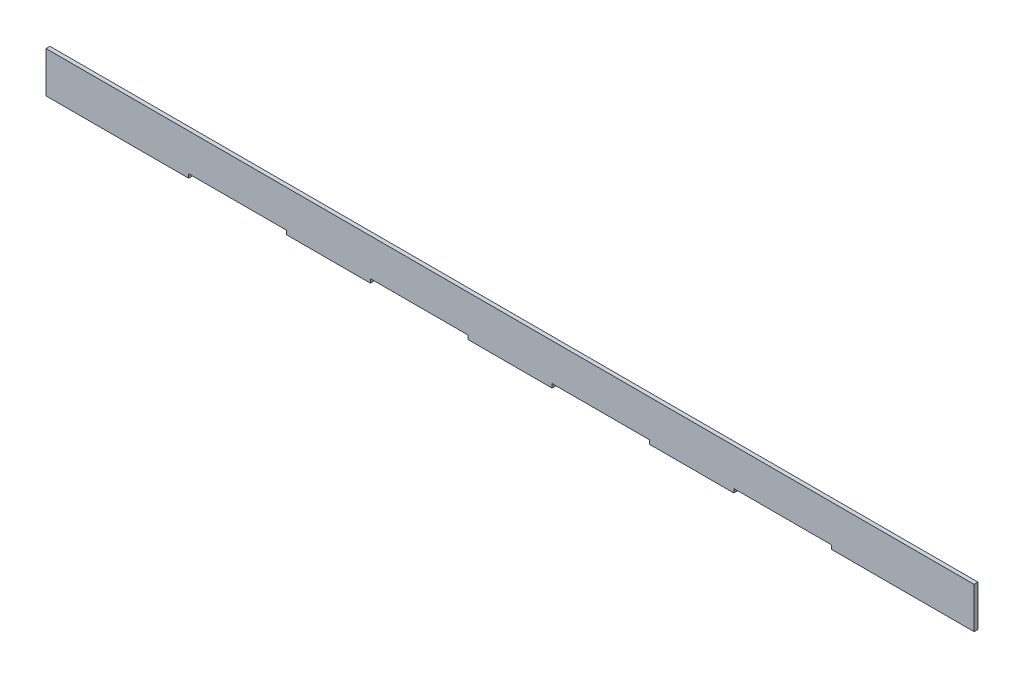
ISO-10303-21;
HEADER;
FILE_DESCRIPTION(('STEP AP214'),'2;1');
FILE_NAME('part.step','',(''),(''),'','','');
FILE_SCHEMA(('AUTOMOTIVE_DESIGN { 1 0 10303 214 1 1 1 1 }'));
ENDSEC;
DATA;
#1=APPLICATION_CONTEXT('core data for automotive mechanical design processes');
#2=APPLICATION_PROTOCOL_DEFINITION('international standard','automotive_design',2000,#1);
#3=PRODUCT_CONTEXT('',#1,'mechanical');
#4=PRODUCT('Part','Part','',(#3));
#5=PRODUCT_RELATED_PRODUCT_CATEGORY('part','',(#4));
#6=PRODUCT_DEFINITION_FORMATION('','',#4);
#7=PRODUCT_DEFINITION_CONTEXT('part definition',#1,'design');
#8=PRODUCT_DEFINITION('design','',#6,#7);
#9=PRODUCT_DEFINITION_SHAPE('','',#8);
#10=(LENGTH_UNIT() NAMED_UNIT(*) SI_UNIT(.MILLI.,.METRE.));
#11=(NAMED_UNIT(*) PLANE_ANGLE_UNIT() SI_UNIT($,.RADIAN.));
#12=(NAMED_UNIT(*) SI_UNIT($,.STERADIAN.) SOLID_ANGLE_UNIT());
#13=UNCERTAINTY_MEASURE_WITH_UNIT(LENGTH_MEASURE(1.E-05),#10,'distance_accuracy_value','');
#14=(GEOMETRIC_REPRESENTATION_CONTEXT(3) GLOBAL_UNCERTAINTY_ASSIGNED_CONTEXT((#13)) GLOBAL_UNIT_ASSIGNED_CONTEXT((#10,
#11,#12)) REPRESENTATION_CONTEXT('',''));
#15=CARTESIAN_POINT('',(0.,0.,0.));
#16=DIRECTION('',(0.,0.,1.));
#17=DIRECTION('',(1.,0.,0.));
#18=AXIS2_PLACEMENT_3D('',#15,#16,#17);
#19=CARTESIAN_POINT('',(-237.5,-10.5,2.));
#20=DIRECTION('',(0.,1.,0.));
#21=DIRECTION('',(0.,0.,1.));
#22=AXIS2_PLACEMENT_3D('',#19,#20,#21);
#23=PLANE('',#22);
#24=DIRECTION('',(0.,0.,1.));
#25=VECTOR('',#24,1.);
#26=CARTESIAN_POINT('',(114.5,-10.5,0.));
#27=LINE('',#26,#25);
#28=CARTESIAN_POINT('',(114.5,-10.5,0.));
#29=VERTEX_POINT('',#28);
#30=CARTESIAN_POINT('',(114.5,-10.5,2.));
#31=VERTEX_POINT('',#30);
#32=EDGE_CURVE('E272',#29,#31,#27,.T.);
#33=ORIENTED_EDGE('',*,*,#32,.T.);
#34=DIRECTION('',(1.,0.,0.));
#35=VECTOR('',#34,1.);
#36=CARTESIAN_POINT('',(-237.5,-10.5,2.));
#37=LINE('',#36,#35);
#38=CARTESIAN_POINT('',(71.5,-10.5,2.));
#39=VERTEX_POINT('',#38);
#40=EDGE_CURVE('E359',#39,#31,#37,.T.);
#41=ORIENTED_EDGE('',*,*,#40,.F.);
#42=DIRECTION('',(0.,0.,1.));
#43=VECTOR('',#42,1.);
#44=CARTESIAN_POINT('',(71.5,-10.5,0.));
#45=LINE('',#44,#43);
#46=CARTESIAN_POINT('',(71.5,-10.5,0.));
#47=VERTEX_POINT('',#46);
#48=EDGE_CURVE('E290',#47,#39,#45,.T.);
#49=ORIENTED_EDGE('',*,*,#48,.F.);
#50=DIRECTION('',(1.,0.,0.));
#51=VECTOR('',#50,1.);
#52=CARTESIAN_POINT('',(-237.5,-10.5,0.));
#53=LINE('',#52,#51);
#54=EDGE_CURVE('E205',#47,#29,#53,.T.);
#55=ORIENTED_EDGE('',*,*,#54,.T.);
#56=EDGE_LOOP('',(#33,#41,#49,#55));
#57=FACE_BOUND('',#56,.T.);
#58=ADVANCED_FACE('F33',(#57),#23,.F.);
#59=DIRECTION('',(0.,0.,1.));
#60=VECTOR('',#59,1.);
#61=CARTESIAN_POINT('',(21.5,-10.5,0.));
#62=LINE('',#61,#60);
#63=CARTESIAN_POINT('',(21.5,-10.5,0.));
#64=VERTEX_POINT('',#63);
#65=CARTESIAN_POINT('',(21.5,-10.5,2.));
#66=VERTEX_POINT('',#65);
#67=EDGE_CURVE('E296',#64,#66,#62,.T.);
#68=ORIENTED_EDGE('',*,*,#67,.T.);
#69=CARTESIAN_POINT('',(-21.5,-10.5,2.));
#70=VERTEX_POINT('',#69);
#71=EDGE_CURVE('E375',#70,#66,#37,.T.);
#72=ORIENTED_EDGE('',*,*,#71,.F.);
#73=DIRECTION('',(0.,0.,1.));
#74=VECTOR('',#73,1.);
#75=CARTESIAN_POINT('',(-21.5,-10.5,0.));
#76=LINE('',#75,#74);
#77=CARTESIAN_POINT('',(-21.5,-10.5,0.));
#78=VERTEX_POINT('',#77);
#79=EDGE_CURVE('E242',#78,#70,#76,.T.);
#80=ORIENTED_EDGE('',*,*,#79,.F.);
#81=EDGE_CURVE('E199',#78,#64,#53,.T.);
#82=ORIENTED_EDGE('',*,*,#81,.T.);
#83=EDGE_LOOP('',(#68,#72,#80,#82));
#84=FACE_BOUND('',#83,.T.);
#85=ADVANCED_FACE('F373',(#84),#23,.F.);
#86=DIRECTION('',(0.,0.,1.));
#87=VECTOR('',#86,1.);
#88=CARTESIAN_POINT('',(-164.5,-10.5,0.));
#89=LINE('',#88,#87);
#90=CARTESIAN_POINT('',(-164.5,-10.5,0.));
#91=VERTEX_POINT('',#90);
#92=CARTESIAN_POINT('',(-164.5,-10.5,2.));
#93=VERTEX_POINT('',#92);
#94=EDGE_CURVE('E259',#91,#93,#89,.T.);
#95=ORIENTED_EDGE('',*,*,#94,.T.);
#96=CARTESIAN_POINT('',(-237.5,-10.5,2.));
#97=VERTEX_POINT('',#96);
#98=EDGE_CURVE('E214',#97,#93,#37,.T.);
#99=ORIENTED_EDGE('',*,*,#98,.F.);
#100=DIRECTION('',(0.,0.,-1.));
#101=VECTOR('',#100,1.);
#102=CARTESIAN_POINT('',(-237.5,-10.5,2.));
#103=LINE('',#102,#101);
#104=CARTESIAN_POINT('',(-237.5,-10.5,0.));
#105=VERTEX_POINT('',#104);
#106=EDGE_CURVE('E213',#97,#105,#103,.T.);
#107=ORIENTED_EDGE('',*,*,#106,.T.);
#108=EDGE_CURVE('E198',#105,#91,#53,.T.);
#109=ORIENTED_EDGE('',*,*,#108,.T.);
#110=EDGE_LOOP('',(#95,#99,#107,#109));
#111=FACE_BOUND('',#110,.T.);
#112=ADVANCED_FACE('F331',(#111),#23,.F.);
#113=CARTESIAN_POINT('',(-114.5,-10.5,2.));
#114=VERTEX_POINT('',#113);
#115=CARTESIAN_POINT('',(-71.5,-10.5,2.));
#116=VERTEX_POINT('',#115);
#117=EDGE_CURVE('E190',#114,#116,#37,.T.);
#118=ORIENTED_EDGE('',*,*,#117,.F.);
#119=DIRECTION('',(0.,0.,1.));
#120=VECTOR('',#119,1.);
#121=CARTESIAN_POINT('',(-114.5,-10.5,0.));
#122=LINE('',#121,#120);
#123=CARTESIAN_POINT('',(-114.5,-10.5,0.));
#124=VERTEX_POINT('',#123);
#125=EDGE_CURVE('E173',#124,#114,#122,.T.);
#126=ORIENTED_EDGE('',*,*,#125,.F.);
#127=CARTESIAN_POINT('',(-71.5,-10.5,0.));
#128=VERTEX_POINT('',#127);
#129=EDGE_CURVE('E188',#124,#128,#53,.T.);
#130=ORIENTED_EDGE('',*,*,#129,.T.);
#131=DIRECTION('',(0.,0.,1.));
#132=VECTOR('',#131,1.);
#133=CARTESIAN_POINT('',(-71.5,-10.5,0.));
#134=LINE('',#133,#132);
#135=EDGE_CURVE('E231',#128,#116,#134,.T.);
#136=ORIENTED_EDGE('',*,*,#135,.T.);
#137=EDGE_LOOP('',(#118,#126,#130,#136));
#138=FACE_BOUND('',#137,.T.);
#139=ADVANCED_FACE('F186',(#138),#23,.F.);
#140=CARTESIAN_POINT('',(0.,0.,2.));
#141=DIRECTION('',(0.,0.,-1.));
#142=DIRECTION('',(-1.,0.,0.));
#143=AXIS2_PLACEMENT_3D('',#140,#141,#142);
#144=PLANE('',#143);
#145=DIRECTION('',(0.,1.,0.));
#146=VECTOR('',#145,1.);
#147=CARTESIAN_POINT('',(114.5,0.,2.));
#148=LINE('',#147,#146);
#149=CARTESIAN_POINT('',(114.5,-8.50000000000001,2.));
#150=VERTEX_POINT('',#149);
#151=EDGE_CURVE('E276',#31,#150,#148,.T.);
#152=ORIENTED_EDGE('',*,*,#151,.T.);
#153=DIRECTION('',(1.,0.,0.));
#154=VECTOR('',#153,1.);
#155=CARTESIAN_POINT('',(0.,-8.50000000000001,2.));
#156=LINE('',#155,#154);
#157=CARTESIAN_POINT('',(164.5,-8.50000000000001,2.));
#158=VERTEX_POINT('',#157);
#159=EDGE_CURVE('E280',#150,#158,#156,.T.);
#160=ORIENTED_EDGE('',*,*,#159,.T.);
#161=DIRECTION('',(0.,1.,0.));
#162=VECTOR('',#161,1.);
#163=CARTESIAN_POINT('',(164.5,0.,2.));
#164=LINE('',#163,#162);
#165=CARTESIAN_POINT('',(164.5,-10.5,2.));
#166=VERTEX_POINT('',#165);
#167=EDGE_CURVE('E283',#166,#158,#164,.T.);
#168=ORIENTED_EDGE('',*,*,#167,.F.);
#169=CARTESIAN_POINT('',(237.5,-10.5,2.));
#170=VERTEX_POINT('',#169);
#171=EDGE_CURVE('E236',#166,#170,#37,.T.);
#172=ORIENTED_EDGE('',*,*,#171,.T.);
#173=DIRECTION('',(0.,1.,0.));
#174=VECTOR('',#173,1.);
#175=CARTESIAN_POINT('',(237.5,-10.5,2.));
#176=LINE('',#175,#174);
#177=CARTESIAN_POINT('',(237.5,10.5,2.));
#178=VERTEX_POINT('',#177);
#179=EDGE_CURVE('E202',#170,#178,#176,.T.);
#180=ORIENTED_EDGE('',*,*,#179,.T.);
#181=DIRECTION('',(-1.,0.,0.));
#182=VECTOR('',#181,1.);
#183=CARTESIAN_POINT('',(-237.5,10.5,2.));
#184=LINE('',#183,#182);
#185=CARTESIAN_POINT('',(-237.5,10.5,2.));
#186=VERTEX_POINT('',#185);
#187=EDGE_CURVE('E238',#178,#186,#184,.T.);
#188=ORIENTED_EDGE('',*,*,#187,.T.);
#189=DIRECTION('',(0.,-1.,0.));
#190=VECTOR('',#189,1.);
#191=CARTESIAN_POINT('',(-237.5,-10.5,2.));
#192=LINE('',#191,#190);
#193=EDGE_CURVE('E223',#186,#97,#192,.T.);
#194=ORIENTED_EDGE('',*,*,#193,.T.);
#195=ORIENTED_EDGE('',*,*,#98,.T.);
#196=DIRECTION('',(0.,1.,0.));
#197=VECTOR('',#196,1.);
#198=CARTESIAN_POINT('',(-164.5,0.,2.));
#199=LINE('',#198,#197);
#200=CARTESIAN_POINT('',(-164.5,-8.5,2.));
#201=VERTEX_POINT('',#200);
#202=EDGE_CURVE('E181',#93,#201,#199,.T.);
#203=ORIENTED_EDGE('',*,*,#202,.T.);
#204=DIRECTION('',(1.,0.,0.));
#205=VECTOR('',#204,1.);
#206=CARTESIAN_POINT('',(0.,-8.5,2.));
#207=LINE('',#206,#205);
#208=CARTESIAN_POINT('',(-114.5,-8.5,2.));
#209=VERTEX_POINT('',#208);
#210=EDGE_CURVE('E320',#201,#209,#207,.T.);
#211=ORIENTED_EDGE('',*,*,#210,.T.);
#212=DIRECTION('',(0.,1.,0.));
#213=VECTOR('',#212,1.);
#214=CARTESIAN_POINT('',(-114.5,0.,2.));
#215=LINE('',#214,#213);
#216=EDGE_CURVE('E299',#114,#209,#215,.T.);
#217=ORIENTED_EDGE('',*,*,#216,.F.);
#218=ORIENTED_EDGE('',*,*,#117,.T.);
#219=DIRECTION('',(0.,1.,0.));
#220=VECTOR('',#219,1.);
#221=CARTESIAN_POINT('',(-71.5,0.,2.));
#222=LINE('',#221,#220);
#223=CARTESIAN_POINT('',(-71.5,-8.5,2.));
#224=VERTEX_POINT('',#223);
#225=EDGE_CURVE('E249',#116,#224,#222,.T.);
#226=ORIENTED_EDGE('',*,*,#225,.T.);
#227=DIRECTION('',(1.,0.,0.));
#228=VECTOR('',#227,1.);
#229=CARTESIAN_POINT('',(0.,-8.5,2.));
#230=LINE('',#229,#228);
#231=CARTESIAN_POINT('',(-21.5,-8.5,2.));
#232=VERTEX_POINT('',#231);
#233=EDGE_CURVE('E253',#224,#232,#230,.T.);
#234=ORIENTED_EDGE('',*,*,#233,.T.);
#235=DIRECTION('',(0.,1.,0.));
#236=VECTOR('',#235,1.);
#237=CARTESIAN_POINT('',(-21.5,0.,2.));
#238=LINE('',#237,#236);
#239=EDGE_CURVE('E256',#70,#232,#238,.T.);
#240=ORIENTED_EDGE('',*,*,#239,.F.);
#241=ORIENTED_EDGE('',*,*,#71,.T.);
#242=DIRECTION('',(0.,1.,0.));
#243=VECTOR('',#242,1.);
#244=CARTESIAN_POINT('',(21.5,0.,2.));
#245=LINE('',#244,#243);
#246=CARTESIAN_POINT('',(21.5,-8.5,2.));
#247=VERTEX_POINT('',#246);
#248=EDGE_CURVE('E300',#66,#247,#245,.T.);
#249=ORIENTED_EDGE('',*,*,#248,.T.);
#250=DIRECTION('',(1.,0.,0.));
#251=VECTOR('',#250,1.);
#252=CARTESIAN_POINT('',(0.,-8.5,2.));
#253=LINE('',#252,#251);
#254=CARTESIAN_POINT('',(71.5,-8.5,2.));
#255=VERTEX_POINT('',#254);
#256=EDGE_CURVE('E304',#247,#255,#253,.T.);
#257=ORIENTED_EDGE('',*,*,#256,.T.);
#258=DIRECTION('',(0.,1.,0.));
#259=VECTOR('',#258,1.);
#260=CARTESIAN_POINT('',(71.5,0.,2.));
#261=LINE('',#260,#259);
#262=EDGE_CURVE('E275',#39,#255,#261,.T.);
#263=ORIENTED_EDGE('',*,*,#262,.F.);
#264=ORIENTED_EDGE('',*,*,#40,.T.);
#265=EDGE_LOOP('',(#152,#160,#168,#172,#180,#188,#194,#195,#203,#211,#217,#218,#226,#234,#240,
#241,#249,#257,#263,#264));
#266=FACE_BOUND('',#265,.T.);
#267=ADVANCED_FACE('F334',(#266),#144,.F.);
#268=CARTESIAN_POINT('',(0.,0.,0.));
#269=DIRECTION('',(0.,0.,-1.));
#270=DIRECTION('',(-1.,0.,0.));
#271=AXIS2_PLACEMENT_3D('',#268,#269,#270);
#272=PLANE('',#271);
#273=DIRECTION('',(1.,0.,0.));
#274=VECTOR('',#273,1.);
#275=CARTESIAN_POINT('',(0.,-8.50000000000001,0.));
#276=LINE('',#275,#274);
#277=CARTESIAN_POINT('',(114.5,-8.50000000000001,0.));
#278=VERTEX_POINT('',#277);
#279=CARTESIAN_POINT('',(164.5,-8.50000000000001,0.));
#280=VERTEX_POINT('',#279);
#281=EDGE_CURVE('E286',#278,#280,#276,.T.);
#282=ORIENTED_EDGE('',*,*,#281,.F.);
#283=DIRECTION('',(0.,1.,0.));
#284=VECTOR('',#283,1.);
#285=CARTESIAN_POINT('',(114.5,0.,0.));
#286=LINE('',#285,#284);
#287=EDGE_CURVE('E268',#29,#278,#286,.T.);
#288=ORIENTED_EDGE('',*,*,#287,.F.);
#289=ORIENTED_EDGE('',*,*,#54,.F.);
#290=DIRECTION('',(0.,1.,0.));
#291=VECTOR('',#290,1.);
#292=CARTESIAN_POINT('',(71.5,0.,0.));
#293=LINE('',#292,#291);
#294=CARTESIAN_POINT('',(71.5,-8.5,0.));
#295=VERTEX_POINT('',#294);
#296=EDGE_CURVE('E303',#47,#295,#293,.T.);
#297=ORIENTED_EDGE('',*,*,#296,.T.);
#298=DIRECTION('',(1.,0.,0.));
#299=VECTOR('',#298,1.);
#300=CARTESIAN_POINT('',(0.,-8.5,0.));
#301=LINE('',#300,#299);
#302=CARTESIAN_POINT('',(21.5,-8.5,0.));
#303=VERTEX_POINT('',#302);
#304=EDGE_CURVE('E309',#303,#295,#301,.T.);
#305=ORIENTED_EDGE('',*,*,#304,.F.);
#306=DIRECTION('',(0.,1.,0.));
#307=VECTOR('',#306,1.);
#308=CARTESIAN_POINT('',(21.5,0.,0.));
#309=LINE('',#308,#307);
#310=EDGE_CURVE('E292',#64,#303,#309,.T.);
#311=ORIENTED_EDGE('',*,*,#310,.F.);
#312=ORIENTED_EDGE('',*,*,#81,.F.);
#313=DIRECTION('',(0.,1.,0.));
#314=VECTOR('',#313,1.);
#315=CARTESIAN_POINT('',(-21.5,0.,0.));
#316=LINE('',#315,#314);
#317=CARTESIAN_POINT('',(-21.5,-8.5,0.));
#318=VERTEX_POINT('',#317);
#319=EDGE_CURVE('E252',#78,#318,#316,.T.);
#320=ORIENTED_EDGE('',*,*,#319,.T.);
#321=DIRECTION('',(1.,0.,0.));
#322=VECTOR('',#321,1.);
#323=CARTESIAN_POINT('',(0.,-8.5,0.));
#324=LINE('',#323,#322);
#325=CARTESIAN_POINT('',(-71.5,-8.5,0.));
#326=VERTEX_POINT('',#325);
#327=EDGE_CURVE('E261',#326,#318,#324,.T.);
#328=ORIENTED_EDGE('',*,*,#327,.F.);
#329=DIRECTION('',(0.,1.,0.));
#330=VECTOR('',#329,1.);
#331=CARTESIAN_POINT('',(-71.5,0.,0.));
#332=LINE('',#331,#330);
#333=EDGE_CURVE('E197',#128,#326,#332,.T.);
#334=ORIENTED_EDGE('',*,*,#333,.F.);
#335=ORIENTED_EDGE('',*,*,#129,.F.);
#336=DIRECTION('',(0.,1.,0.));
#337=VECTOR('',#336,1.);
#338=CARTESIAN_POINT('',(-114.5,0.,0.));
#339=LINE('',#338,#337);
#340=CARTESIAN_POINT('',(-114.5,-8.5,0.));
#341=VERTEX_POINT('',#340);
#342=EDGE_CURVE('E169',#124,#341,#339,.T.);
#343=ORIENTED_EDGE('',*,*,#342,.T.);
#344=DIRECTION('',(1.,0.,0.));
#345=VECTOR('',#344,1.);
#346=CARTESIAN_POINT('',(0.,-8.5,0.));
#347=LINE('',#346,#345);
#348=CARTESIAN_POINT('',(-164.5,-8.5,0.));
#349=VERTEX_POINT('',#348);
#350=EDGE_CURVE('E180',#349,#341,#347,.T.);
#351=ORIENTED_EDGE('',*,*,#350,.F.);
#352=DIRECTION('',(0.,1.,0.));
#353=VECTOR('',#352,1.);
#354=CARTESIAN_POINT('',(-164.5,0.,0.));
#355=LINE('',#354,#353);
#356=EDGE_CURVE('E191',#91,#349,#355,.T.);
#357=ORIENTED_EDGE('',*,*,#356,.F.);
#358=ORIENTED_EDGE('',*,*,#108,.F.);
#359=DIRECTION('',(0.,-1.,0.));
#360=VECTOR('',#359,1.);
#361=CARTESIAN_POINT('',(-237.5,-10.5,0.));
#362=LINE('',#361,#360);
#363=CARTESIAN_POINT('',(-237.5,10.5,0.));
#364=VERTEX_POINT('',#363);
#365=EDGE_CURVE('E208',#364,#105,#362,.T.);
#366=ORIENTED_EDGE('',*,*,#365,.F.);
#367=DIRECTION('',(-1.,0.,0.));
#368=VECTOR('',#367,1.);
#369=CARTESIAN_POINT('',(-237.5,10.5,0.));
#370=LINE('',#369,#368);
#371=CARTESIAN_POINT('',(237.5,10.5,0.));
#372=VERTEX_POINT('',#371);
#373=EDGE_CURVE('E227',#372,#364,#370,.T.);
#374=ORIENTED_EDGE('',*,*,#373,.F.);
#375=DIRECTION('',(0.,1.,0.));
#376=VECTOR('',#375,1.);
#377=CARTESIAN_POINT('',(237.5,-10.5,0.));
#378=LINE('',#377,#376);
#379=CARTESIAN_POINT('',(237.5,-10.5,0.));
#380=VERTEX_POINT('',#379);
#381=EDGE_CURVE('E229',#380,#372,#378,.T.);
#382=ORIENTED_EDGE('',*,*,#381,.F.);
#383=CARTESIAN_POINT('',(164.5,-10.5,0.));
#384=VERTEX_POINT('',#383);
#385=EDGE_CURVE('E203',#384,#380,#53,.T.);
#386=ORIENTED_EDGE('',*,*,#385,.F.);
#387=DIRECTION('',(0.,1.,0.));
#388=VECTOR('',#387,1.);
#389=CARTESIAN_POINT('',(164.5,0.,0.));
#390=LINE('',#389,#388);
#391=EDGE_CURVE('E279',#384,#280,#390,.T.);
#392=ORIENTED_EDGE('',*,*,#391,.T.);
#393=EDGE_LOOP('',(#282,#288,#289,#297,#305,#311,#312,#320,#328,#334,#335,#343,#351,#357,#358,
#366,#374,#382,#386,#392));
#394=FACE_BOUND('',#393,.T.);
#395=ADVANCED_FACE('F195',(#394),#272,.T.);
#396=CARTESIAN_POINT('',(237.5,-10.5,2.));
#397=DIRECTION('',(-1.,0.,0.));
#398=DIRECTION('',(0.,0.,1.));
#399=AXIS2_PLACEMENT_3D('',#396,#397,#398);
#400=PLANE('',#399);
#401=ORIENTED_EDGE('',*,*,#381,.T.);
#402=DIRECTION('',(0.,0.,-1.));
#403=VECTOR('',#402,1.);
#404=CARTESIAN_POINT('',(237.5,10.5,2.));
#405=LINE('',#404,#403);
#406=EDGE_CURVE('E11',#178,#372,#405,.T.);
#407=ORIENTED_EDGE('',*,*,#406,.F.);
#408=ORIENTED_EDGE('',*,*,#179,.F.);
#409=DIRECTION('',(0.,0.,-1.));
#410=VECTOR('',#409,1.);
#411=CARTESIAN_POINT('',(237.5,-10.5,2.));
#412=LINE('',#411,#410);
#413=EDGE_CURVE('E210',#170,#380,#412,.T.);
#414=ORIENTED_EDGE('',*,*,#413,.T.);
#415=EDGE_LOOP('',(#401,#407,#408,#414));
#416=FACE_BOUND('',#415,.T.);
#417=ADVANCED_FACE('F35',(#416),#400,.F.);
#418=CARTESIAN_POINT('',(-237.5,10.5,2.));
#419=DIRECTION('',(0.,-1.,0.));
#420=DIRECTION('',(0.,0.,-1.));
#421=AXIS2_PLACEMENT_3D('',#418,#419,#420);
#422=PLANE('',#421);
#423=ORIENTED_EDGE('',*,*,#373,.T.);
#424=DIRECTION('',(0.,0.,-1.));
#425=VECTOR('',#424,1.);
#426=CARTESIAN_POINT('',(-237.5,10.5,2.));
#427=LINE('',#426,#425);
#428=EDGE_CURVE('E41',#186,#364,#427,.T.);
#429=ORIENTED_EDGE('',*,*,#428,.F.);
#430=ORIENTED_EDGE('',*,*,#187,.F.);
#431=ORIENTED_EDGE('',*,*,#406,.T.);
#432=EDGE_LOOP('',(#423,#429,#430,#431));
#433=FACE_BOUND('',#432,.T.);
#434=ADVANCED_FACE('F337',(#433),#422,.F.);
#435=CARTESIAN_POINT('',(-237.5,-10.5,2.));
#436=DIRECTION('',(1.,0.,0.));
#437=DIRECTION('',(0.,1.,0.));
#438=AXIS2_PLACEMENT_3D('',#435,#436,#437);
#439=PLANE('',#438);
#440=ORIENTED_EDGE('',*,*,#365,.T.);
#441=ORIENTED_EDGE('',*,*,#106,.F.);
#442=ORIENTED_EDGE('',*,*,#193,.F.);
#443=ORIENTED_EDGE('',*,*,#428,.T.);
#444=EDGE_LOOP('',(#440,#441,#442,#443));
#445=FACE_BOUND('',#444,.T.);
#446=ADVANCED_FACE('F221',(#445),#439,.F.);
#447=ORIENTED_EDGE('',*,*,#171,.F.);
#448=DIRECTION('',(0.,0.,1.));
#449=VECTOR('',#448,1.);
#450=CARTESIAN_POINT('',(164.5,-10.5,0.));
#451=LINE('',#450,#449);
#452=EDGE_CURVE('E266',#384,#166,#451,.T.);
#453=ORIENTED_EDGE('',*,*,#452,.F.);
#454=ORIENTED_EDGE('',*,*,#385,.T.);
#455=ORIENTED_EDGE('',*,*,#413,.F.);
#456=EDGE_LOOP('',(#447,#453,#454,#455));
#457=FACE_BOUND('',#456,.T.);
#458=ADVANCED_FACE('F344',(#457),#23,.F.);
#459=CARTESIAN_POINT('',(-71.5,0.,0.));
#460=DIRECTION('',(1.,0.,0.));
#461=DIRECTION('',(0.,0.,-1.));
#462=AXIS2_PLACEMENT_3D('',#459,#460,#461);
#463=PLANE('',#462);
#464=ORIENTED_EDGE('',*,*,#225,.F.);
#465=ORIENTED_EDGE('',*,*,#135,.F.);
#466=ORIENTED_EDGE('',*,*,#333,.T.);
#467=DIRECTION('',(0.,0.,1.));
#468=VECTOR('',#467,1.);
#469=CARTESIAN_POINT('',(-71.5,-8.5,0.));
#470=LINE('',#469,#468);
#471=EDGE_CURVE('E246',#326,#224,#470,.T.);
#472=ORIENTED_EDGE('',*,*,#471,.T.);
#473=EDGE_LOOP('',(#464,#465,#466,#472));
#474=FACE_BOUND('',#473,.T.);
#475=ADVANCED_FACE('F384',(#474),#463,.T.);
#476=CARTESIAN_POINT('',(0.,-8.5,0.));
#477=DIRECTION('',(0.,-1.,0.));
#478=DIRECTION('',(0.,0.,-1.));
#479=AXIS2_PLACEMENT_3D('',#476,#477,#478);
#480=PLANE('',#479);
#481=ORIENTED_EDGE('',*,*,#233,.F.);
#482=ORIENTED_EDGE('',*,*,#471,.F.);
#483=ORIENTED_EDGE('',*,*,#327,.T.);
#484=DIRECTION('',(0.,0.,1.));
#485=VECTOR('',#484,1.);
#486=CARTESIAN_POINT('',(-21.5,-8.5,0.));
#487=LINE('',#486,#485);
#488=EDGE_CURVE('E244',#318,#232,#487,.T.);
#489=ORIENTED_EDGE('',*,*,#488,.T.);
#490=EDGE_LOOP('',(#481,#482,#483,#489));
#491=FACE_BOUND('',#490,.T.);
#492=ADVANCED_FACE('F382',(#491),#480,.T.);
#493=CARTESIAN_POINT('',(-21.5,0.,0.));
#494=DIRECTION('',(1.,0.,0.));
#495=DIRECTION('',(0.,0.,-1.));
#496=AXIS2_PLACEMENT_3D('',#493,#494,#495);
#497=PLANE('',#496);
#498=ORIENTED_EDGE('',*,*,#239,.T.);
#499=ORIENTED_EDGE('',*,*,#488,.F.);
#500=ORIENTED_EDGE('',*,*,#319,.F.);
#501=ORIENTED_EDGE('',*,*,#79,.T.);
#502=EDGE_LOOP('',(#498,#499,#500,#501));
#503=FACE_BOUND('',#502,.T.);
#504=ADVANCED_FACE('F378',(#503),#497,.F.);
#505=CARTESIAN_POINT('',(-164.5,0.,0.));
#506=DIRECTION('',(1.,0.,0.));
#507=DIRECTION('',(0.,0.,-1.));
#508=AXIS2_PLACEMENT_3D('',#505,#506,#507);
#509=PLANE('',#508);
#510=ORIENTED_EDGE('',*,*,#202,.F.);
#511=ORIENTED_EDGE('',*,*,#94,.F.);
#512=ORIENTED_EDGE('',*,*,#356,.T.);
#513=DIRECTION('',(0.,0.,1.));
#514=VECTOR('',#513,1.);
#515=CARTESIAN_POINT('',(-164.5,-8.5,0.));
#516=LINE('',#515,#514);
#517=EDGE_CURVE('E314',#349,#201,#516,.T.);
#518=ORIENTED_EDGE('',*,*,#517,.T.);
#519=EDGE_LOOP('',(#510,#511,#512,#518));
#520=FACE_BOUND('',#519,.T.);
#521=ADVANCED_FACE('F417',(#520),#509,.T.);
#522=CARTESIAN_POINT('',(0.,-8.5,0.));
#523=DIRECTION('',(0.,-1.,0.));
#524=DIRECTION('',(0.,0.,-1.));
#525=AXIS2_PLACEMENT_3D('',#522,#523,#524);
#526=PLANE('',#525);
#527=ORIENTED_EDGE('',*,*,#210,.F.);
#528=ORIENTED_EDGE('',*,*,#517,.F.);
#529=ORIENTED_EDGE('',*,*,#350,.T.);
#530=DIRECTION('',(0.,0.,1.));
#531=VECTOR('',#530,1.);
#532=CARTESIAN_POINT('',(-114.5,-8.5,0.));
#533=LINE('',#532,#531);
#534=EDGE_CURVE('E175',#341,#209,#533,.T.);
#535=ORIENTED_EDGE('',*,*,#534,.T.);
#536=EDGE_LOOP('',(#527,#528,#529,#535));
#537=FACE_BOUND('',#536,.T.);
#538=ADVANCED_FACE('F328',(#537),#526,.T.);
#539=CARTESIAN_POINT('',(-114.5,0.,0.));
#540=DIRECTION('',(1.,0.,0.));
#541=DIRECTION('',(0.,0.,-1.));
#542=AXIS2_PLACEMENT_3D('',#539,#540,#541);
#543=PLANE('',#542);
#544=ORIENTED_EDGE('',*,*,#216,.T.);
#545=ORIENTED_EDGE('',*,*,#534,.F.);
#546=ORIENTED_EDGE('',*,*,#342,.F.);
#547=ORIENTED_EDGE('',*,*,#125,.T.);
#548=EDGE_LOOP('',(#544,#545,#546,#547));
#549=FACE_BOUND('',#548,.T.);
#550=ADVANCED_FACE('F172',(#549),#543,.F.);
#551=CARTESIAN_POINT('',(21.5,0.,0.));
#552=DIRECTION('',(1.,0.,0.));
#553=DIRECTION('',(0.,0.,-1.));
#554=AXIS2_PLACEMENT_3D('',#551,#552,#553);
#555=PLANE('',#554);
#556=ORIENTED_EDGE('',*,*,#248,.F.);
#557=ORIENTED_EDGE('',*,*,#67,.F.);
#558=ORIENTED_EDGE('',*,*,#310,.T.);
#559=DIRECTION('',(0.,0.,1.));
#560=VECTOR('',#559,1.);
#561=CARTESIAN_POINT('',(21.5,-8.5,0.));
#562=LINE('',#561,#560);
#563=EDGE_CURVE('E294',#303,#247,#562,.T.);
#564=ORIENTED_EDGE('',*,*,#563,.T.);
#565=EDGE_LOOP('',(#556,#557,#558,#564));
#566=FACE_BOUND('',#565,.T.);
#567=ADVANCED_FACE('F429',(#566),#555,.T.);
#568=CARTESIAN_POINT('',(0.,-8.5,0.));
#569=DIRECTION('',(0.,-1.,0.));
#570=DIRECTION('',(0.,0.,-1.));
#571=AXIS2_PLACEMENT_3D('',#568,#569,#570);
#572=PLANE('',#571);
#573=ORIENTED_EDGE('',*,*,#256,.F.);
#574=ORIENTED_EDGE('',*,*,#563,.F.);
#575=ORIENTED_EDGE('',*,*,#304,.T.);
#576=DIRECTION('',(0.,0.,1.));
#577=VECTOR('',#576,1.);
#578=CARTESIAN_POINT('',(71.5,-8.5,0.));
#579=LINE('',#578,#577);
#580=EDGE_CURVE('E56',#295,#255,#579,.T.);
#581=ORIENTED_EDGE('',*,*,#580,.T.);
#582=EDGE_LOOP('',(#573,#574,#575,#581));
#583=FACE_BOUND('',#582,.T.);
#584=ADVANCED_FACE('F366',(#583),#572,.T.);
#585=CARTESIAN_POINT('',(71.5,0.,0.));
#586=DIRECTION('',(1.,0.,0.));
#587=DIRECTION('',(0.,0.,-1.));
#588=AXIS2_PLACEMENT_3D('',#585,#586,#587);
#589=PLANE('',#588);
#590=ORIENTED_EDGE('',*,*,#262,.T.);
#591=ORIENTED_EDGE('',*,*,#580,.F.);
#592=ORIENTED_EDGE('',*,*,#296,.F.);
#593=ORIENTED_EDGE('',*,*,#48,.T.);
#594=EDGE_LOOP('',(#590,#591,#592,#593));
#595=FACE_BOUND('',#594,.T.);
#596=ADVANCED_FACE('F361',(#595),#589,.F.);
#597=CARTESIAN_POINT('',(114.5,0.,0.));
#598=DIRECTION('',(1.,0.,0.));
#599=DIRECTION('',(0.,0.,-1.));
#600=AXIS2_PLACEMENT_3D('',#597,#598,#599);
#601=PLANE('',#600);
#602=ORIENTED_EDGE('',*,*,#151,.F.);
#603=ORIENTED_EDGE('',*,*,#32,.F.);
#604=ORIENTED_EDGE('',*,*,#287,.T.);
#605=DIRECTION('',(0.,0.,1.));
#606=VECTOR('',#605,1.);
#607=CARTESIAN_POINT('',(114.5,-8.50000000000001,0.));
#608=LINE('',#607,#606);
#609=EDGE_CURVE('E270',#278,#150,#608,.T.);
#610=ORIENTED_EDGE('',*,*,#609,.T.);
#611=EDGE_LOOP('',(#602,#603,#604,#610));
#612=FACE_BOUND('',#611,.T.);
#613=ADVANCED_FACE('F436',(#612),#601,.T.);
#614=CARTESIAN_POINT('',(0.,-8.50000000000001,0.));
#615=DIRECTION('',(0.,-1.,0.));
#616=DIRECTION('',(0.,0.,-1.));
#617=AXIS2_PLACEMENT_3D('',#614,#615,#616);
#618=PLANE('',#617);
#619=ORIENTED_EDGE('',*,*,#159,.F.);
#620=ORIENTED_EDGE('',*,*,#609,.F.);
#621=ORIENTED_EDGE('',*,*,#281,.T.);
#622=DIRECTION('',(0.,0.,1.));
#623=VECTOR('',#622,1.);
#624=CARTESIAN_POINT('',(164.5,-8.50000000000001,0.));
#625=LINE('',#624,#623);
#626=EDGE_CURVE('E48',#280,#158,#625,.T.);
#627=ORIENTED_EDGE('',*,*,#626,.T.);
#628=EDGE_LOOP('',(#619,#620,#621,#627));
#629=FACE_BOUND('',#628,.T.);
#630=ADVANCED_FACE('F351',(#629),#618,.T.);
#631=CARTESIAN_POINT('',(164.5,0.,0.));
#632=DIRECTION('',(1.,0.,0.));
#633=DIRECTION('',(0.,0.,-1.));
#634=AXIS2_PLACEMENT_3D('',#631,#632,#633);
#635=PLANE('',#634);
#636=ORIENTED_EDGE('',*,*,#167,.T.);
#637=ORIENTED_EDGE('',*,*,#626,.F.);
#638=ORIENTED_EDGE('',*,*,#391,.F.);
#639=ORIENTED_EDGE('',*,*,#452,.T.);
#640=EDGE_LOOP('',(#636,#637,#638,#639));
#641=FACE_BOUND('',#640,.T.);
#642=ADVANCED_FACE('F346',(#641),#635,.F.);
#643=CLOSED_SHELL('',(#58,#85,#112,#139,#267,#395,#417,#434,#446,#458,#475,#492,#504,#521,#538,
#550,#567,#584,#596,#613,#630,#642));
#644=MANIFOLD_SOLID_BREP('B2',#643);
#645=ADVANCED_BREP_SHAPE_REPRESENTATION('',(#18,#644),#14);
#646=SHAPE_DEFINITION_REPRESENTATION(#9,#645);
ENDSEC;
END-ISO-10303-21;
